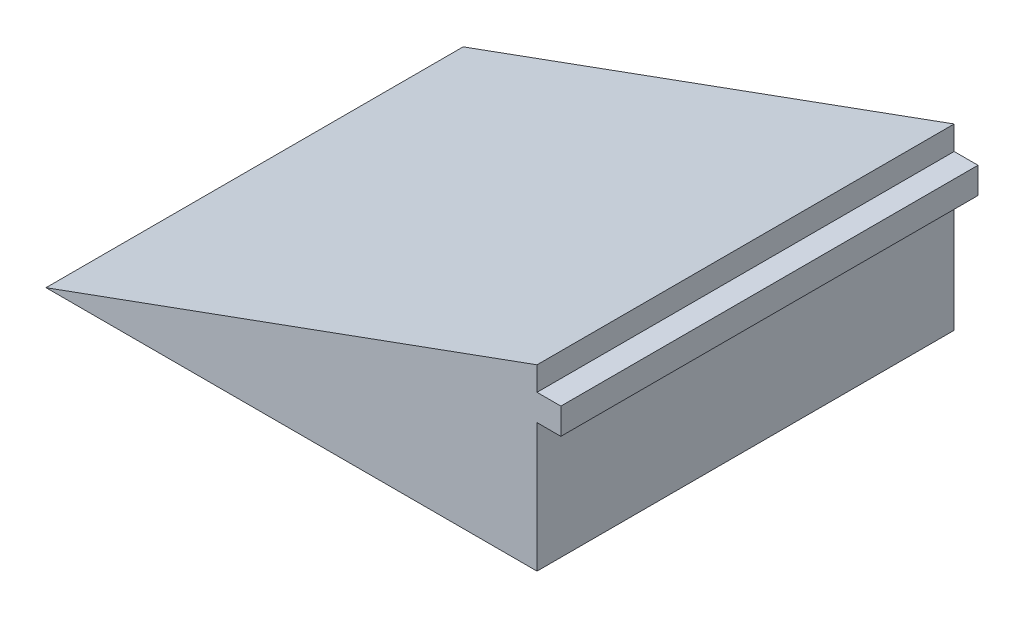
ISO-10303-21;
HEADER;
FILE_DESCRIPTION(('STEP AP214'),'2;1');
FILE_NAME('part.step','',(''),(''),'','','');
FILE_SCHEMA(('AUTOMOTIVE_DESIGN { 1 0 10303 214 1 1 1 1 }'));
ENDSEC;
DATA;
#1=APPLICATION_CONTEXT('core data for automotive mechanical design processes');
#2=APPLICATION_PROTOCOL_DEFINITION('international standard','automotive_design',2000,#1);
#3=PRODUCT_CONTEXT('',#1,'mechanical');
#4=PRODUCT('Part','Part','',(#3));
#5=PRODUCT_RELATED_PRODUCT_CATEGORY('part','',(#4));
#6=PRODUCT_DEFINITION_FORMATION('','',#4);
#7=PRODUCT_DEFINITION_CONTEXT('part definition',#1,'design');
#8=PRODUCT_DEFINITION('design','',#6,#7);
#9=PRODUCT_DEFINITION_SHAPE('','',#8);
#10=(LENGTH_UNIT() NAMED_UNIT(*) SI_UNIT(.MILLI.,.METRE.));
#11=(NAMED_UNIT(*) PLANE_ANGLE_UNIT() SI_UNIT($,.RADIAN.));
#12=(NAMED_UNIT(*) SI_UNIT($,.STERADIAN.) SOLID_ANGLE_UNIT());
#13=UNCERTAINTY_MEASURE_WITH_UNIT(LENGTH_MEASURE(1.E-05),#10,'distance_accuracy_value','');
#14=(GEOMETRIC_REPRESENTATION_CONTEXT(3) GLOBAL_UNCERTAINTY_ASSIGNED_CONTEXT((#13)) GLOBAL_UNIT_ASSIGNED_CONTEXT((#10,
#11,#12)) REPRESENTATION_CONTEXT('',''));
#15=CARTESIAN_POINT('',(0.,0.,0.));
#16=DIRECTION('',(0.,0.,1.));
#17=DIRECTION('',(1.,0.,0.));
#18=AXIS2_PLACEMENT_3D('',#15,#16,#17);
#19=CARTESIAN_POINT('',(412.,0.,350.));
#20=DIRECTION('',(-1.,0.,0.));
#21=DIRECTION('',(0.,0.,1.));
#22=AXIS2_PLACEMENT_3D('',#19,#20,#21);
#23=PLANE('',#22);
#24=DIRECTION('',(0.,0.,1.));
#25=VECTOR('',#24,1.);
#26=CARTESIAN_POINT('',(412.,129.9557,350.));
#27=LINE('',#26,#25);
#28=CARTESIAN_POINT('',(412.,129.9557,0.));
#29=VERTEX_POINT('',#28);
#30=CARTESIAN_POINT('',(412.,129.9557,350.));
#31=VERTEX_POINT('',#30);
#32=EDGE_CURVE('E117',#29,#31,#27,.T.);
#33=ORIENTED_EDGE('',*,*,#32,.F.);
#34=DIRECTION('',(0.,1.,0.));
#35=VECTOR('',#34,1.);
#36=CARTESIAN_POINT('',(412.,0.,0.));
#37=LINE('',#36,#35);
#38=CARTESIAN_POINT('',(412.,149.9557,0.));
#39=VERTEX_POINT('',#38);
#40=EDGE_CURVE('E139',#29,#39,#37,.T.);
#41=ORIENTED_EDGE('',*,*,#40,.T.);
#42=DIRECTION('',(0.,0.,-1.));
#43=VECTOR('',#42,1.);
#44=CARTESIAN_POINT('',(412.,149.9557,350.));
#45=LINE('',#44,#43);
#46=CARTESIAN_POINT('',(412.,149.9557,350.));
#47=VERTEX_POINT('',#46);
#48=EDGE_CURVE('E136',#47,#39,#45,.T.);
#49=ORIENTED_EDGE('',*,*,#48,.F.);
#50=DIRECTION('',(0.,1.,0.));
#51=VECTOR('',#50,1.);
#52=CARTESIAN_POINT('',(412.,0.,350.));
#53=LINE('',#52,#51);
#54=EDGE_CURVE('E53',#31,#47,#53,.T.);
#55=ORIENTED_EDGE('',*,*,#54,.F.);
#56=EDGE_LOOP('',(#33,#41,#49,#55));
#57=FACE_BOUND('',#56,.T.);
#58=ADVANCED_FACE('F38',(#57),#23,.F.);
#59=DIRECTION('',(0.,0.,-1.));
#60=VECTOR('',#59,1.);
#61=CARTESIAN_POINT('',(412.,107.9557,350.));
#62=LINE('',#61,#60);
#63=CARTESIAN_POINT('',(412.,107.9557,350.));
#64=VERTEX_POINT('',#63);
#65=CARTESIAN_POINT('',(412.,107.9557,0.));
#66=VERTEX_POINT('',#65);
#67=EDGE_CURVE('E61',#64,#66,#62,.T.);
#68=ORIENTED_EDGE('',*,*,#67,.F.);
#69=CARTESIAN_POINT('',(412.,0.,350.));
#70=VERTEX_POINT('',#69);
#71=EDGE_CURVE('E121',#70,#64,#53,.T.);
#72=ORIENTED_EDGE('',*,*,#71,.F.);
#73=DIRECTION('',(0.,0.,-1.));
#74=VECTOR('',#73,1.);
#75=CARTESIAN_POINT('',(412.,0.,350.));
#76=LINE('',#75,#74);
#77=CARTESIAN_POINT('',(412.,0.,0.));
#78=VERTEX_POINT('',#77);
#79=EDGE_CURVE('E46',#70,#78,#76,.T.);
#80=ORIENTED_EDGE('',*,*,#79,.T.);
#81=EDGE_CURVE('E134',#78,#66,#37,.T.);
#82=ORIENTED_EDGE('',*,*,#81,.T.);
#83=EDGE_LOOP('',(#68,#72,#80,#82));
#84=FACE_BOUND('',#83,.T.);
#85=ADVANCED_FACE('F145',(#84),#23,.F.);
#86=CARTESIAN_POINT('',(412.,149.9557,350.));
#87=DIRECTION('',(0.342020069778938,-0.939692647554726,0.));
#88=DIRECTION('',(0.939692647554726,0.342020069778938,0.));
#89=AXIS2_PLACEMENT_3D('',#86,#87,#88);
#90=PLANE('',#89);
#91=DIRECTION('',(-0.939692647554726,-0.342020069778938,0.));
#92=VECTOR('',#91,1.);
#93=CARTESIAN_POINT('',(412.,149.9557,0.));
#94=LINE('',#93,#92);
#95=CARTESIAN_POINT('',(0.,0.,0.));
#96=VERTEX_POINT('',#95);
#97=EDGE_CURVE('E122',#39,#96,#94,.T.);
#98=ORIENTED_EDGE('',*,*,#97,.T.);
#99=DIRECTION('',(0.,0.,-1.));
#100=VECTOR('',#99,1.);
#101=CARTESIAN_POINT('',(0.,0.,350.));
#102=LINE('',#101,#100);
#103=CARTESIAN_POINT('',(0.,0.,350.));
#104=VERTEX_POINT('',#103);
#105=EDGE_CURVE('E11',#104,#96,#102,.T.);
#106=ORIENTED_EDGE('',*,*,#105,.F.);
#107=DIRECTION('',(-0.939692647554726,-0.342020069778938,0.));
#108=VECTOR('',#107,1.);
#109=CARTESIAN_POINT('',(412.,149.9557,350.));
#110=LINE('',#109,#108);
#111=EDGE_CURVE('E131',#47,#104,#110,.T.);
#112=ORIENTED_EDGE('',*,*,#111,.F.);
#113=ORIENTED_EDGE('',*,*,#48,.T.);
#114=EDGE_LOOP('',(#98,#106,#112,#113));
#115=FACE_BOUND('',#114,.T.);
#116=ADVANCED_FACE('F40',(#115),#90,.F.);
#117=CARTESIAN_POINT('',(0.,0.,350.));
#118=DIRECTION('',(0.,1.,0.));
#119=DIRECTION('',(0.,0.,1.));
#120=AXIS2_PLACEMENT_3D('',#117,#118,#119);
#121=PLANE('',#120);
#122=DIRECTION('',(1.,0.,0.));
#123=VECTOR('',#122,1.);
#124=CARTESIAN_POINT('',(0.,0.,0.));
#125=LINE('',#124,#123);
#126=EDGE_CURVE('E125',#96,#78,#125,.T.);
#127=ORIENTED_EDGE('',*,*,#126,.T.);
#128=ORIENTED_EDGE('',*,*,#79,.F.);
#129=DIRECTION('',(1.,0.,0.));
#130=VECTOR('',#129,1.);
#131=CARTESIAN_POINT('',(0.,0.,350.));
#132=LINE('',#131,#130);
#133=EDGE_CURVE('E133',#104,#70,#132,.T.);
#134=ORIENTED_EDGE('',*,*,#133,.F.);
#135=ORIENTED_EDGE('',*,*,#105,.T.);
#136=EDGE_LOOP('',(#127,#128,#134,#135));
#137=FACE_BOUND('',#136,.T.);
#138=ADVANCED_FACE('F164',(#137),#121,.F.);
#139=CARTESIAN_POINT('',(0.,0.,350.));
#140=DIRECTION('',(0.,0.,-1.));
#141=DIRECTION('',(-1.,0.,0.));
#142=AXIS2_PLACEMENT_3D('',#139,#140,#141);
#143=PLANE('',#142);
#144=ORIENTED_EDGE('',*,*,#111,.T.);
#145=ORIENTED_EDGE('',*,*,#133,.T.);
#146=ORIENTED_EDGE('',*,*,#71,.T.);
#147=DIRECTION('',(-1.,0.,0.));
#148=VECTOR('',#147,1.);
#149=CARTESIAN_POINT('',(432.,107.9557,350.));
#150=LINE('',#149,#148);
#151=CARTESIAN_POINT('',(432.,107.9557,350.));
#152=VERTEX_POINT('',#151);
#153=EDGE_CURVE('E102',#152,#64,#150,.T.);
#154=ORIENTED_EDGE('',*,*,#153,.F.);
#155=DIRECTION('',(0.,-1.,0.));
#156=VECTOR('',#155,1.);
#157=CARTESIAN_POINT('',(432.,129.9557,350.));
#158=LINE('',#157,#156);
#159=CARTESIAN_POINT('',(432.,129.9557,350.));
#160=VERTEX_POINT('',#159);
#161=EDGE_CURVE('E108',#160,#152,#158,.T.);
#162=ORIENTED_EDGE('',*,*,#161,.F.);
#163=DIRECTION('',(-1.,0.,0.));
#164=VECTOR('',#163,1.);
#165=CARTESIAN_POINT('',(432.,129.9557,350.));
#166=LINE('',#165,#164);
#167=EDGE_CURVE('E154',#160,#31,#166,.T.);
#168=ORIENTED_EDGE('',*,*,#167,.T.);
#169=ORIENTED_EDGE('',*,*,#54,.T.);
#170=EDGE_LOOP('',(#144,#145,#146,#154,#162,#168,#169));
#171=FACE_BOUND('',#170,.T.);
#172=ADVANCED_FACE('F120',(#171),#143,.F.);
#173=CARTESIAN_POINT('',(0.,0.,0.));
#174=DIRECTION('',(0.,0.,-1.));
#175=DIRECTION('',(-1.,0.,0.));
#176=AXIS2_PLACEMENT_3D('',#173,#174,#175);
#177=PLANE('',#176);
#178=ORIENTED_EDGE('',*,*,#97,.F.);
#179=ORIENTED_EDGE('',*,*,#40,.F.);
#180=DIRECTION('',(-1.,0.,0.));
#181=VECTOR('',#180,1.);
#182=CARTESIAN_POINT('',(432.,129.9557,0.));
#183=LINE('',#182,#181);
#184=CARTESIAN_POINT('',(432.,129.9557,0.));
#185=VERTEX_POINT('',#184);
#186=EDGE_CURVE('E127',#185,#29,#183,.T.);
#187=ORIENTED_EDGE('',*,*,#186,.F.);
#188=DIRECTION('',(0.,1.,0.));
#189=VECTOR('',#188,1.);
#190=CARTESIAN_POINT('',(432.,129.9557,0.));
#191=LINE('',#190,#189);
#192=CARTESIAN_POINT('',(432.,107.9557,0.));
#193=VERTEX_POINT('',#192);
#194=EDGE_CURVE('E107',#193,#185,#191,.T.);
#195=ORIENTED_EDGE('',*,*,#194,.F.);
#196=DIRECTION('',(-1.,0.,0.));
#197=VECTOR('',#196,1.);
#198=CARTESIAN_POINT('',(432.,107.9557,0.));
#199=LINE('',#198,#197);
#200=EDGE_CURVE('E104',#193,#66,#199,.T.);
#201=ORIENTED_EDGE('',*,*,#200,.T.);
#202=ORIENTED_EDGE('',*,*,#81,.F.);
#203=ORIENTED_EDGE('',*,*,#126,.F.);
#204=EDGE_LOOP('',(#178,#179,#187,#195,#201,#202,#203));
#205=FACE_BOUND('',#204,.T.);
#206=ADVANCED_FACE('F149',(#205),#177,.T.);
#207=CARTESIAN_POINT('',(432.,107.9557,350.));
#208=DIRECTION('',(0.,1.,0.));
#209=DIRECTION('',(0.,0.,1.));
#210=AXIS2_PLACEMENT_3D('',#207,#208,#209);
#211=PLANE('',#210);
#212=ORIENTED_EDGE('',*,*,#67,.T.);
#213=ORIENTED_EDGE('',*,*,#200,.F.);
#214=DIRECTION('',(0.,0.,-1.));
#215=VECTOR('',#214,1.);
#216=CARTESIAN_POINT('',(432.,107.9557,350.));
#217=LINE('',#216,#215);
#218=EDGE_CURVE('E98',#152,#193,#217,.T.);
#219=ORIENTED_EDGE('',*,*,#218,.F.);
#220=ORIENTED_EDGE('',*,*,#153,.T.);
#221=EDGE_LOOP('',(#212,#213,#219,#220));
#222=FACE_BOUND('',#221,.T.);
#223=ADVANCED_FACE('F100',(#222),#211,.F.);
#224=CARTESIAN_POINT('',(432.,129.9557,350.));
#225=DIRECTION('',(0.,-1.,0.));
#226=DIRECTION('',(0.,0.,-1.));
#227=AXIS2_PLACEMENT_3D('',#224,#225,#226);
#228=PLANE('',#227);
#229=ORIENTED_EDGE('',*,*,#32,.T.);
#230=ORIENTED_EDGE('',*,*,#167,.F.);
#231=DIRECTION('',(0.,0.,1.));
#232=VECTOR('',#231,1.);
#233=CARTESIAN_POINT('',(432.,129.9557,350.));
#234=LINE('',#233,#232);
#235=EDGE_CURVE('E113',#185,#160,#234,.T.);
#236=ORIENTED_EDGE('',*,*,#235,.F.);
#237=ORIENTED_EDGE('',*,*,#186,.T.);
#238=EDGE_LOOP('',(#229,#230,#236,#237));
#239=FACE_BOUND('',#238,.T.);
#240=ADVANCED_FACE('F160',(#239),#228,.F.);
#241=CARTESIAN_POINT('',(432.,0.,0.));
#242=DIRECTION('',(1.,0.,0.));
#243=DIRECTION('',(0.,0.,-1.));
#244=AXIS2_PLACEMENT_3D('',#241,#242,#243);
#245=PLANE('',#244);
#246=ORIENTED_EDGE('',*,*,#161,.T.);
#247=ORIENTED_EDGE('',*,*,#218,.T.);
#248=ORIENTED_EDGE('',*,*,#194,.T.);
#249=ORIENTED_EDGE('',*,*,#235,.T.);
#250=EDGE_LOOP('',(#246,#247,#248,#249));
#251=FACE_BOUND('',#250,.T.);
#252=ADVANCED_FACE('F111',(#251),#245,.T.);
#253=CLOSED_SHELL('',(#58,#85,#116,#138,#172,#206,#223,#240,#252));
#254=MANIFOLD_SOLID_BREP('B2',#253);
#255=ADVANCED_BREP_SHAPE_REPRESENTATION('',(#18,#254),#14);
#256=SHAPE_DEFINITION_REPRESENTATION(#9,#255);
ENDSEC;
END-ISO-10303-21;
